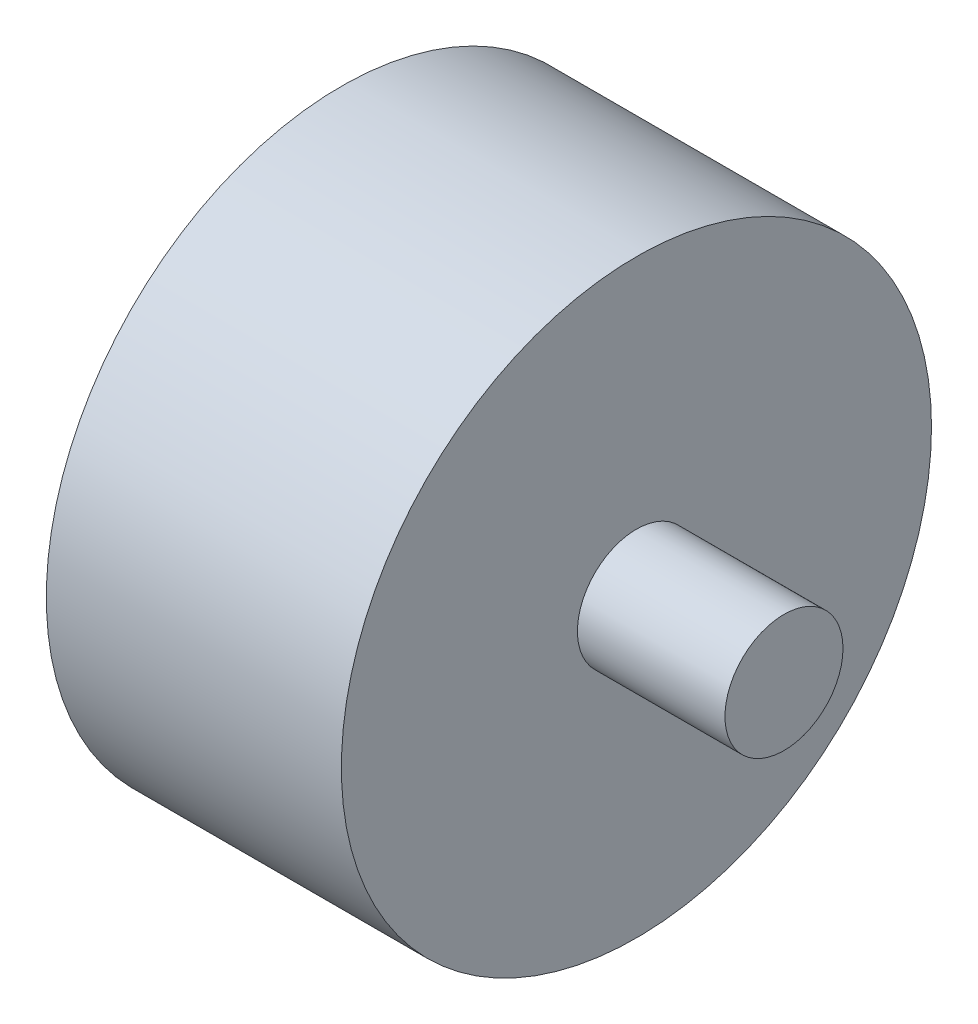
ISO-10303-21;
HEADER;
FILE_DESCRIPTION(('STEP AP214'),'2;1');
FILE_NAME('part.step','',(''),(''),'','','');
FILE_SCHEMA(('AUTOMOTIVE_DESIGN { 1 0 10303 214 1 1 1 1 }'));
ENDSEC;
DATA;
#1=APPLICATION_CONTEXT('core data for automotive mechanical design processes');
#2=APPLICATION_PROTOCOL_DEFINITION('international standard','automotive_design',2000,#1);
#3=PRODUCT_CONTEXT('',#1,'mechanical');
#4=PRODUCT('Part','Part','',(#3));
#5=PRODUCT_RELATED_PRODUCT_CATEGORY('part','',(#4));
#6=PRODUCT_DEFINITION_FORMATION('','',#4);
#7=PRODUCT_DEFINITION_CONTEXT('part definition',#1,'design');
#8=PRODUCT_DEFINITION('design','',#6,#7);
#9=PRODUCT_DEFINITION_SHAPE('','',#8);
#10=(LENGTH_UNIT() NAMED_UNIT(*) SI_UNIT(.MILLI.,.METRE.));
#11=(NAMED_UNIT(*) PLANE_ANGLE_UNIT() SI_UNIT($,.RADIAN.));
#12=(NAMED_UNIT(*) SI_UNIT($,.STERADIAN.) SOLID_ANGLE_UNIT());
#13=UNCERTAINTY_MEASURE_WITH_UNIT(LENGTH_MEASURE(1.E-05),#10,'distance_accuracy_value','');
#14=(GEOMETRIC_REPRESENTATION_CONTEXT(3) GLOBAL_UNCERTAINTY_ASSIGNED_CONTEXT((#13)) GLOBAL_UNIT_ASSIGNED_CONTEXT((#10,
#11,#12)) REPRESENTATION_CONTEXT('',''));
#15=CARTESIAN_POINT('',(0.,0.,0.));
#16=DIRECTION('',(0.,0.,1.));
#17=DIRECTION('',(1.,0.,0.));
#18=AXIS2_PLACEMENT_3D('',#15,#16,#17);
#19=CARTESIAN_POINT('',(-10.,0.,0.));
#20=DIRECTION('',(1.,0.,0.));
#21=DIRECTION('',(0.,0.,-1.));
#22=AXIS2_PLACEMENT_3D('',#19,#20,#21);
#23=CYLINDRICAL_SURFACE('',#22,4.);
#24=CARTESIAN_POINT('',(-10.,0.,0.));
#25=DIRECTION('',(1.,0.,0.));
#26=DIRECTION('',(0.,0.,-1.));
#27=AXIS2_PLACEMENT_3D('',#24,#25,#26);
#28=CIRCLE('',#27,4.);
#29=CARTESIAN_POINT('',(-10.,0.,-4.));
#30=VERTEX_POINT('',#29);
#31=EDGE_CURVE('E10',#30,#30,#28,.T.);
#32=ORIENTED_EDGE('',*,*,#31,.T.);
#33=EDGE_LOOP('',(#32));
#34=FACE_BOUND('',#33,.T.);
#35=CARTESIAN_POINT('',(0.,0.,0.));
#36=DIRECTION('',(1.,0.,0.));
#37=DIRECTION('',(0.,0.,-1.));
#38=AXIS2_PLACEMENT_3D('',#35,#36,#37);
#39=CIRCLE('',#38,4.);
#40=CARTESIAN_POINT('',(0.,0.,-4.));
#41=VERTEX_POINT('',#40);
#42=EDGE_CURVE('E59',#41,#41,#39,.T.);
#43=ORIENTED_EDGE('',*,*,#42,.F.);
#44=EDGE_LOOP('',(#43));
#45=FACE_BOUND('',#44,.T.);
#46=ADVANCED_FACE('F37',(#34,#45),#23,.T.);
#47=CARTESIAN_POINT('',(-10.,4.,0.));
#48=DIRECTION('',(-1.,0.,0.));
#49=DIRECTION('',(0.,0.,1.));
#50=AXIS2_PLACEMENT_3D('',#47,#48,#49);
#51=PLANE('',#50);
#52=ORIENTED_EDGE('',*,*,#31,.F.);
#53=EDGE_LOOP('',(#52));
#54=FACE_BOUND('',#53,.T.);
#55=ADVANCED_FACE('F67',(#54),#51,.T.);
#56=CARTESIAN_POINT('',(30.,0.,0.));
#57=DIRECTION('',(1.,0.,0.));
#58=DIRECTION('',(0.,0.,-1.));
#59=AXIS2_PLACEMENT_3D('',#56,#57,#58);
#60=PLANE('',#59);
#61=CARTESIAN_POINT('',(30.,0.,0.));
#62=DIRECTION('',(1.,0.,0.));
#63=DIRECTION('',(0.,0.,-1.));
#64=AXIS2_PLACEMENT_3D('',#61,#62,#63);
#65=CIRCLE('',#64,4.);
#66=CARTESIAN_POINT('',(30.,0.,-4.));
#67=VERTEX_POINT('',#66);
#68=EDGE_CURVE('E43',#67,#67,#65,.T.);
#69=ORIENTED_EDGE('',*,*,#68,.T.);
#70=EDGE_LOOP('',(#69));
#71=FACE_BOUND('',#70,.T.);
#72=ADVANCED_FACE('F71',(#71),#60,.T.);
#73=CARTESIAN_POINT('',(-10.,0.,0.));
#74=DIRECTION('',(1.,0.,0.));
#75=DIRECTION('',(0.,0.,-1.));
#76=AXIS2_PLACEMENT_3D('',#73,#74,#75);
#77=CYLINDRICAL_SURFACE('',#76,4.);
#78=CARTESIAN_POINT('',(20.,0.,0.));
#79=DIRECTION('',(1.,0.,0.));
#80=DIRECTION('',(0.,0.,-1.));
#81=AXIS2_PLACEMENT_3D('',#78,#79,#80);
#82=CIRCLE('',#81,4.);
#83=CARTESIAN_POINT('',(20.,0.,-4.));
#84=VERTEX_POINT('',#83);
#85=EDGE_CURVE('E47',#84,#84,#82,.T.);
#86=ORIENTED_EDGE('',*,*,#85,.T.);
#87=EDGE_LOOP('',(#86));
#88=FACE_BOUND('',#87,.T.);
#89=ORIENTED_EDGE('',*,*,#68,.F.);
#90=EDGE_LOOP('',(#89));
#91=FACE_BOUND('',#90,.T.);
#92=ADVANCED_FACE('F76',(#88,#91),#77,.T.);
#93=CARTESIAN_POINT('',(20.,4.,0.));
#94=DIRECTION('',(1.,0.,0.));
#95=DIRECTION('',(0.,0.,-1.));
#96=AXIS2_PLACEMENT_3D('',#93,#94,#95);
#97=PLANE('',#96);
#98=CARTESIAN_POINT('',(20.,0.,0.));
#99=DIRECTION('',(1.,0.,0.));
#100=DIRECTION('',(0.,0.,-1.));
#101=AXIS2_PLACEMENT_3D('',#98,#99,#100);
#102=CIRCLE('',#101,20.);
#103=CARTESIAN_POINT('',(20.,0.,-20.));
#104=VERTEX_POINT('',#103);
#105=EDGE_CURVE('E51',#104,#104,#102,.T.);
#106=ORIENTED_EDGE('',*,*,#105,.T.);
#107=EDGE_LOOP('',(#106));
#108=FACE_BOUND('',#107,.T.);
#109=ORIENTED_EDGE('',*,*,#85,.F.);
#110=EDGE_LOOP('',(#109));
#111=FACE_BOUND('',#110,.T.);
#112=ADVANCED_FACE('F81',(#108,#111),#97,.T.);
#113=CARTESIAN_POINT('',(-10.,0.,0.));
#114=DIRECTION('',(1.,0.,0.));
#115=DIRECTION('',(0.,0.,-1.));
#116=AXIS2_PLACEMENT_3D('',#113,#114,#115);
#117=CYLINDRICAL_SURFACE('',#116,20.);
#118=CARTESIAN_POINT('',(0.,0.,0.));
#119=DIRECTION('',(1.,0.,0.));
#120=DIRECTION('',(0.,0.,-1.));
#121=AXIS2_PLACEMENT_3D('',#118,#119,#120);
#122=CIRCLE('',#121,20.);
#123=CARTESIAN_POINT('',(0.,0.,-20.));
#124=VERTEX_POINT('',#123);
#125=EDGE_CURVE('E56',#124,#124,#122,.T.);
#126=ORIENTED_EDGE('',*,*,#125,.T.);
#127=EDGE_LOOP('',(#126));
#128=FACE_BOUND('',#127,.T.);
#129=ORIENTED_EDGE('',*,*,#105,.F.);
#130=EDGE_LOOP('',(#129));
#131=FACE_BOUND('',#130,.T.);
#132=ADVANCED_FACE('F85',(#128,#131),#117,.T.);
#133=CARTESIAN_POINT('',(0.,20.,0.));
#134=DIRECTION('',(-1.,0.,0.));
#135=DIRECTION('',(0.,0.,1.));
#136=AXIS2_PLACEMENT_3D('',#133,#134,#135);
#137=PLANE('',#136);
#138=ORIENTED_EDGE('',*,*,#42,.T.);
#139=EDGE_LOOP('',(#138));
#140=FACE_BOUND('',#139,.T.);
#141=ORIENTED_EDGE('',*,*,#125,.F.);
#142=EDGE_LOOP('',(#141));
#143=FACE_BOUND('',#142,.T.);
#144=ADVANCED_FACE('F63',(#140,#143),#137,.T.);
#145=CLOSED_SHELL('',(#46,#55,#72,#92,#112,#132,#144));
#146=MANIFOLD_SOLID_BREP('B2',#145);
#147=ADVANCED_BREP_SHAPE_REPRESENTATION('',(#18,#146),#14);
#148=SHAPE_DEFINITION_REPRESENTATION(#9,#147);
ENDSEC;
END-ISO-10303-21;
